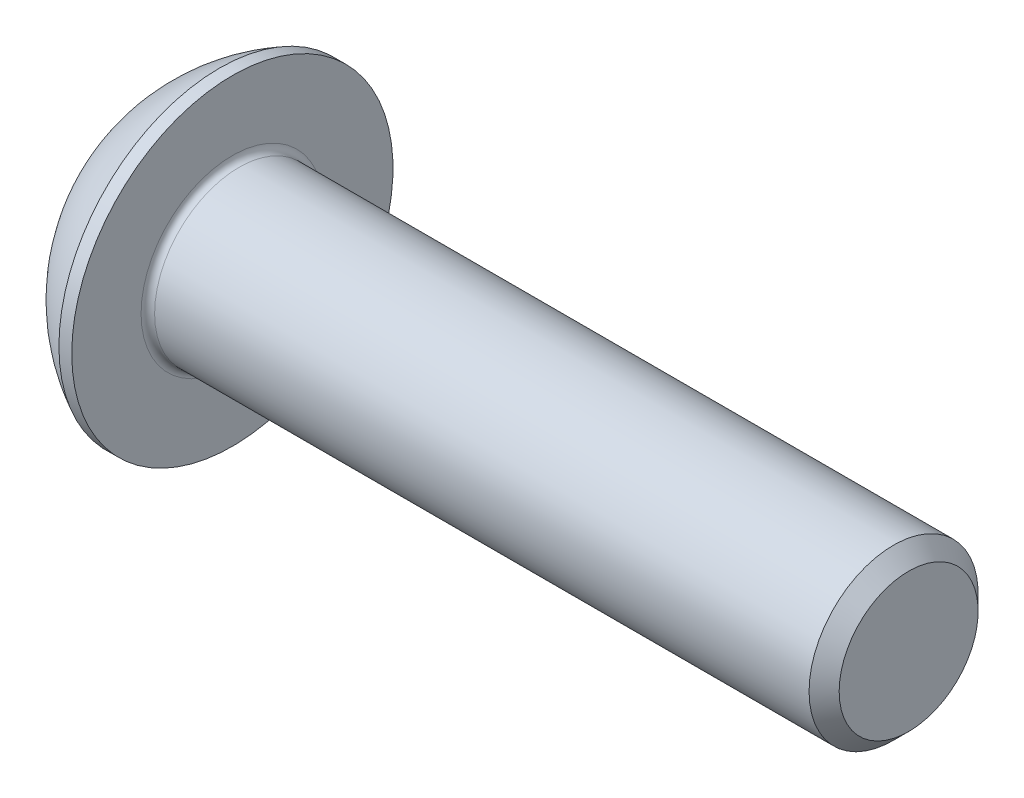
ISO-10303-21;
HEADER;
FILE_DESCRIPTION(('STEP AP214'),'2;1');
FILE_NAME('part.step','',(''),(''),'','','');
FILE_SCHEMA(('AUTOMOTIVE_DESIGN { 1 0 10303 214 1 1 1 1 }'));
ENDSEC;
DATA;
#1=APPLICATION_CONTEXT('core data for automotive mechanical design processes');
#2=APPLICATION_PROTOCOL_DEFINITION('international standard','automotive_design',2000,#1);
#3=PRODUCT_CONTEXT('',#1,'mechanical');
#4=PRODUCT('Part','Part','',(#3));
#5=PRODUCT_RELATED_PRODUCT_CATEGORY('part','',(#4));
#6=PRODUCT_DEFINITION_FORMATION('','',#4);
#7=PRODUCT_DEFINITION_CONTEXT('part definition',#1,'design');
#8=PRODUCT_DEFINITION('design','',#6,#7);
#9=PRODUCT_DEFINITION_SHAPE('','',#8);
#10=(LENGTH_UNIT() NAMED_UNIT(*) SI_UNIT(.MILLI.,.METRE.));
#11=(NAMED_UNIT(*) PLANE_ANGLE_UNIT() SI_UNIT($,.RADIAN.));
#12=(NAMED_UNIT(*) SI_UNIT($,.STERADIAN.) SOLID_ANGLE_UNIT());
#13=UNCERTAINTY_MEASURE_WITH_UNIT(LENGTH_MEASURE(1.E-05),#10,'distance_accuracy_value','');
#14=(GEOMETRIC_REPRESENTATION_CONTEXT(3) GLOBAL_UNCERTAINTY_ASSIGNED_CONTEXT((#13)) GLOBAL_UNIT_ASSIGNED_CONTEXT((#10,
#11,#12)) REPRESENTATION_CONTEXT('',''));
#15=CARTESIAN_POINT('',(0.,0.,0.));
#16=DIRECTION('',(0.,0.,1.));
#17=DIRECTION('',(1.,0.,0.));
#18=AXIS2_PLACEMENT_3D('',#15,#16,#17);
#19=CARTESIAN_POINT('',(0.,0.,0.));
#20=DIRECTION('',(-1.,0.,0.));
#21=DIRECTION('',(0.,0.,1.));
#22=AXIS2_PLACEMENT_3D('',#19,#20,#21);
#23=PLANE('',#22);
#24=CARTESIAN_POINT('',(0.,0.,0.));
#25=DIRECTION('',(-1.,0.,0.));
#26=DIRECTION('',(0.,0.,1.));
#27=AXIS2_PLACEMENT_3D('',#24,#25,#26);
#28=CIRCLE('',#27,2.375);
#29=CARTESIAN_POINT('',(0.,2.375,0.));
#30=VERTEX_POINT('',#29);
#31=EDGE_CURVE('E159',#30,#30,#28,.T.);
#32=ORIENTED_EDGE('',*,*,#31,.T.);
#33=EDGE_LOOP('',(#32));
#34=FACE_BOUND('',#33,.T.);
#35=DIRECTION('',(0.,-1.,0.));
#36=VECTOR('',#35,1.);
#37=CARTESIAN_POINT('',(0.,-0.866025403784438,1.5));
#38=LINE('',#37,#36);
#39=CARTESIAN_POINT('',(0.,0.866025403784439,1.5));
#40=VERTEX_POINT('',#39);
#41=CARTESIAN_POINT('',(0.,-0.866025403784438,1.5));
#42=VERTEX_POINT('',#41);
#43=EDGE_CURVE('E54',#40,#42,#38,.T.);
#44=ORIENTED_EDGE('',*,*,#43,.T.);
#45=DIRECTION('',(0.,-0.5,-0.866025403784438));
#46=VECTOR('',#45,1.);
#47=CARTESIAN_POINT('',(0.,-1.73205080756888,0.));
#48=LINE('',#47,#46);
#49=CARTESIAN_POINT('',(0.,-1.73205080756888,0.));
#50=VERTEX_POINT('',#49);
#51=EDGE_CURVE('E279',#42,#50,#48,.T.);
#52=ORIENTED_EDGE('',*,*,#51,.T.);
#53=DIRECTION('',(0.,0.5,-0.866025403784438));
#54=VECTOR('',#53,1.);
#55=CARTESIAN_POINT('',(0.,-0.866025403784438,-1.5));
#56=LINE('',#55,#54);
#57=CARTESIAN_POINT('',(0.,-0.866025403784438,-1.5));
#58=VERTEX_POINT('',#57);
#59=EDGE_CURVE('E134',#50,#58,#56,.T.);
#60=ORIENTED_EDGE('',*,*,#59,.T.);
#61=DIRECTION('',(0.,1.,0.));
#62=VECTOR('',#61,1.);
#63=CARTESIAN_POINT('',(0.,0.866025403784439,-1.5));
#64=LINE('',#63,#62);
#65=CARTESIAN_POINT('',(0.,0.866025403784439,-1.5));
#66=VERTEX_POINT('',#65);
#67=EDGE_CURVE('E282',#58,#66,#64,.T.);
#68=ORIENTED_EDGE('',*,*,#67,.T.);
#69=DIRECTION('',(0.,0.5,0.866025403784439));
#70=VECTOR('',#69,1.);
#71=CARTESIAN_POINT('',(0.,1.73205080756888,0.));
#72=LINE('',#71,#70);
#73=CARTESIAN_POINT('',(0.,1.73205080756888,0.));
#74=VERTEX_POINT('',#73);
#75=EDGE_CURVE('E284',#66,#74,#72,.T.);
#76=ORIENTED_EDGE('',*,*,#75,.T.);
#77=DIRECTION('',(0.,-0.5,0.866025403784439));
#78=VECTOR('',#77,1.);
#79=CARTESIAN_POINT('',(0.,0.866025403784439,1.5));
#80=LINE('',#79,#78);
#81=EDGE_CURVE('E286',#74,#40,#80,.T.);
#82=ORIENTED_EDGE('',*,*,#81,.T.);
#83=EDGE_LOOP('',(#44,#52,#60,#68,#76,#82));
#84=FACE_BOUND('',#83,.T.);
#85=ADVANCED_FACE('F39',(#34,#84),#23,.T.);
#86=CARTESIAN_POINT('',(4.75501582278481,0.,0.));
#87=DIRECTION('',(-1.,0.,0.));
#88=DIRECTION('',(0.,1.,0.));
#89=AXIS2_PLACEMENT_3D('',#86,#87,#88);
#90=SPHERICAL_SURFACE('',#89,5.3151482081814);
#91=CARTESIAN_POINT('',(2.37,0.,0.));
#92=DIRECTION('',(-1.,0.,0.));
#93=DIRECTION('',(0.,0.,1.));
#94=AXIS2_PLACEMENT_3D('',#91,#92,#93);
#95=CIRCLE('',#94,4.75);
#96=CARTESIAN_POINT('',(2.37,4.75,0.));
#97=VERTEX_POINT('',#96);
#98=EDGE_CURVE('E156',#97,#97,#95,.T.);
#99=CARTESIAN_POINT('',(2.37,4.75,0.));
#100=CARTESIAN_POINT('',(2.33822259048669,4.73404434732511,0.));
#101=CARTESIAN_POINT('',(2.30660534291523,4.71776971995817,0.));
#102=CARTESIAN_POINT('',(2.24370380094997,4.68458927158339,0.));
#103=CARTESIAN_POINT('',(2.21241950655618,4.66768345057555,0.));
#104=CARTESIAN_POINT('',(2.15019650024021,4.6332473706621,0.));
#105=CARTESIAN_POINT('',(2.11925778831804,4.6157171117565,0.));
#106=CARTESIAN_POINT('',(2.05773840110808,4.58003923142985,0.));
#107=CARTESIAN_POINT('',(2.02715772582028,4.56189161000879,0.));
#108=CARTESIAN_POINT('',(1.96636673145741,4.52498631044657,0.));
#109=CARTESIAN_POINT('',(1.93615641238234,4.50622863230542,0.));
#110=CARTESIAN_POINT('',(1.87611829826807,4.46811077571318,0.));
#111=CARTESIAN_POINT('',(1.84629050322887,4.44875059726211,0.));
#112=CARTESIAN_POINT('',(1.78702945162455,4.40943553782984,0.));
#113=CARTESIAN_POINT('',(1.75759619505941,4.38948065684866,0.));
#114=CARTESIAN_POINT('',(1.69913607574061,4.34898423002648,0.));
#115=CARTESIAN_POINT('',(1.67010921298694,4.32844268418549,0.));
#116=CARTESIAN_POINT('',(1.61247357298735,4.28678120152175,0.));
#117=CARTESIAN_POINT('',(1.58386479574143,4.265661264699,0.));
#118=CARTESIAN_POINT('',(1.52707685004032,4.22285150694424,0.));
#119=CARTESIAN_POINT('',(1.49889768158512,4.20116168601223,0.));
#120=CARTESIAN_POINT('',(1.44298030371049,4.15722089644741,0.));
#121=CARTESIAN_POINT('',(1.41524209429107,4.13496992781461,0.));
#122=CARTESIAN_POINT('',(1.36021780711889,4.08991580528235,0.));
#123=CARTESIAN_POINT('',(1.33293172936613,4.06711265138288,0.));
#124=CARTESIAN_POINT('',(1.278822696045,4.02096334316478,0.));
#125=CARTESIAN_POINT('',(1.25199974047662,3.99761718884614,0.));
#126=CARTESIAN_POINT('',(1.19882775550162,3.95039128335163,0.));
#127=CARTESIAN_POINT('',(1.172478726095,3.92651153217576,0.));
#128=CARTESIAN_POINT('',(1.1202652065289,3.87822805145535,0.));
#129=CARTESIAN_POINT('',(1.09440071636942,3.85382432191081,0.));
#130=CARTESIAN_POINT('',(1.04316669321617,3.8045027139941,0.));
#131=CARTESIAN_POINT('',(1.01779716022241,3.77958483562192,0.));
#132=CARTESIAN_POINT('',(0.967563269956099,3.72924496668416,0.));
#133=CARTESIAN_POINT('',(0.942698912683561,3.70382297611859,0.));
#134=CARTESIAN_POINT('',(0.893485388936279,3.65248512247887,0.));
#135=CARTESIAN_POINT('',(0.869136222461535,3.62656925940472,0.));
#136=CARTESIAN_POINT('',(0.820962887873489,3.57425409935884,0.));
#137=CARTESIAN_POINT('',(0.797138719760187,3.54785480238711,0.));
#138=CARTESIAN_POINT('',(0.750024977995377,3.49458340787865,0.));
#139=CARTESIAN_POINT('',(0.726735404343868,3.46771131034191,0.));
#140=CARTESIAN_POINT('',(0.68070023227454,3.41350513847464,0.));
#141=CARTESIAN_POINT('',(0.65795463385672,3.3861710641441,0.));
#142=CARTESIAN_POINT('',(0.613016573919582,3.33105194853939,0.));
#143=CARTESIAN_POINT('',(0.590824112400263,3.30326690726522,0.));
#144=CARTESIAN_POINT('',(0.547001265128254,3.24725704926748,0.));
#145=CARTESIAN_POINT('',(0.525370879375564,3.21903223254391,0.));
#146=CARTESIAN_POINT('',(0.482680896105489,3.16215419227901,0.));
#147=CARTESIAN_POINT('',(0.461621298588104,3.13350096873769,0.));
#148=CARTESIAN_POINT('',(0.420081374357153,3.07577765602272,0.));
#149=CARTESIAN_POINT('',(0.399601047643587,3.04670756684908,0.));
#150=CARTESIAN_POINT('',(0.359227914239947,2.98816223197683,0.));
#151=CARTESIAN_POINT('',(0.339335107549872,2.95868698627821,0.));
#152=CARTESIAN_POINT('',(0.300145026860786,2.89934321060632,0.));
#153=CARTESIAN_POINT('',(0.280847752861776,2.86947468063304,0.));
#154=CARTESIAN_POINT('',(0.24285650999714,2.80935636725696,0.));
#155=CARTESIAN_POINT('',(0.224162541131515,2.77910658385417,0.));
#156=CARTESIAN_POINT('',(0.187385439283607,2.71823794734018,0.));
#157=CARTESIAN_POINT('',(0.169302306301325,2.68761909422898,0.));
#158=CARTESIAN_POINT('',(0.133754156035989,2.626024653246,0.));
#159=CARTESIAN_POINT('',(0.116289138752934,2.59504906537421,0.));
#160=CARTESIAN_POINT('',(0.081984269005742,2.53275362391635,0.));
#161=CARTESIAN_POINT('',(0.0651444165416041,2.50143377033028,0.));
#162=CARTESIAN_POINT('',(0.0320966055444299,2.43846244094735,0.));
#163=CARTESIAN_POINT('',(0.0158886470113937,2.40681096515049,0.));
#164=CARTESIAN_POINT('',(0.,2.375,0.));
#165=B_SPLINE_CURVE_WITH_KNOTS('',3,(#99,#100,#101,#102,#103,#104,#105,#106,#107,#108,#109,#110,
#111,#112,#113,#114,#115,#116,#117,#118,#119,#120,#121,#122,#123,#124,#125,#126,#127,#128,#129,
#130,#131,#132,#133,#134,#135,#136,#137,#138,#139,#140,#141,#142,#143,#144,#145,#146,#147,#148,
#149,#150,#151,#152,#153,#154,#155,#156,#157,#158,#159,#160,#161,#162,#163,#164),.UNSPECIFIED.,
.F.,.F.,(4,2,2,2,2,2,2,2,2,2,2,2,2,2,2,2,2,2,2,2,2,2,2,2,2,2,2,2,2,2,2,2,4),(0.,
0.106672849678272,0.213345699356545,0.320018549034817,0.42669139871309,0.533364248391363,
0.640037098069636,0.746709947747908,0.85338279742618,0.960055647104453,1.06672849678273,
1.173401346461,1.28007419613927,1.38674704581754,1.49341989549582,1.60009274517409,
1.70676559485236,1.81343844453063,1.92011129420891,2.02678414388718,2.13345699356545,
2.24012984324372,2.346802692922,2.45347554260027,2.56014839227854,2.66682124195681,
2.77349409163509,2.88016694131336,2.98683979099163,3.0935126406699,3.20018549034818,
3.30685834002645,3.41353118970472),.UNSPECIFIED.);
#166=EDGE_CURVE('BSEAM180',#97,#30,#165,.T.);
#167=ORIENTED_EDGE('',*,*,#98,.T.);
#168=ORIENTED_EDGE('',*,*,#31,.F.);
#169=ORIENTED_EDGE('',*,*,#166,.T.);
#170=ORIENTED_EDGE('',*,*,#166,.F.);
#171=EDGE_LOOP('',(#167,#169,#168,#170));
#172=FACE_BOUND('',#171,.T.);
#173=ADVANCED_FACE('F180',(#172),#90,.T.);
#174=CARTESIAN_POINT('',(0.,0.,0.));
#175=DIRECTION('',(-1.,0.,0.));
#176=DIRECTION('',(0.,0.,1.));
#177=AXIS2_PLACEMENT_3D('',#174,#175,#176);
#178=CYLINDRICAL_SURFACE('',#177,4.75);
#179=ORIENTED_EDGE('',*,*,#98,.F.);
#180=EDGE_LOOP('',(#179));
#181=FACE_BOUND('',#180,.T.);
#182=CARTESIAN_POINT('',(2.75,0.,0.));
#183=DIRECTION('',(-1.,0.,0.));
#184=DIRECTION('',(0.,0.,1.));
#185=AXIS2_PLACEMENT_3D('',#182,#183,#184);
#186=CIRCLE('',#185,4.75);
#187=CARTESIAN_POINT('',(2.75,0.,4.75));
#188=VERTEX_POINT('',#187);
#189=EDGE_CURVE('E153',#188,#188,#186,.T.);
#190=ORIENTED_EDGE('',*,*,#189,.T.);
#191=EDGE_LOOP('',(#190));
#192=FACE_BOUND('',#191,.T.);
#193=ADVANCED_FACE('F185',(#181,#192),#178,.T.);
#194=CARTESIAN_POINT('',(2.75,2.5,0.));
#195=DIRECTION('',(-1.,0.,0.));
#196=DIRECTION('',(0.,0.,1.));
#197=AXIS2_PLACEMENT_3D('',#194,#195,#196);
#198=PLANE('',#197);
#199=CARTESIAN_POINT('',(2.75,0.,0.));
#200=DIRECTION('',(-1.,0.,0.));
#201=DIRECTION('',(0.,0.,1.));
#202=AXIS2_PLACEMENT_3D('',#199,#200,#201);
#203=CIRCLE('',#202,2.7);
#204=CARTESIAN_POINT('',(2.75,0.,2.7));
#205=VERTEX_POINT('',#204);
#206=EDGE_CURVE('E47',#205,#205,#203,.T.);
#207=ORIENTED_EDGE('',*,*,#206,.T.);
#208=EDGE_LOOP('',(#207));
#209=FACE_BOUND('',#208,.T.);
#210=ORIENTED_EDGE('',*,*,#189,.F.);
#211=EDGE_LOOP('',(#210));
#212=FACE_BOUND('',#211,.T.);
#213=ADVANCED_FACE('F164',(#209,#212),#198,.F.);
#214=CARTESIAN_POINT('',(0.,0.,0.));
#215=DIRECTION('',(-1.,0.,0.));
#216=DIRECTION('',(0.,0.,1.));
#217=AXIS2_PLACEMENT_3D('',#214,#215,#216);
#218=CYLINDRICAL_SURFACE('',#217,2.5);
#219=CARTESIAN_POINT('',(2.95,0.,0.));
#220=DIRECTION('',(-1.,0.,0.));
#221=DIRECTION('',(0.,0.,1.));
#222=AXIS2_PLACEMENT_3D('',#219,#220,#221);
#223=CIRCLE('',#222,2.5);
#224=CARTESIAN_POINT('',(2.95,0.,2.5));
#225=VERTEX_POINT('',#224);
#226=EDGE_CURVE('E11',#225,#225,#223,.F.);
#227=ORIENTED_EDGE('',*,*,#226,.T.);
#228=EDGE_LOOP('',(#227));
#229=FACE_BOUND('',#228,.T.);
#230=CARTESIAN_POINT('',(22.305,0.,0.));
#231=DIRECTION('',(-1.,0.,0.));
#232=DIRECTION('',(0.,0.,1.));
#233=AXIS2_PLACEMENT_3D('',#230,#231,#232);
#234=CIRCLE('',#233,2.5);
#235=CARTESIAN_POINT('',(22.305,0.,2.5));
#236=VERTEX_POINT('',#235);
#237=EDGE_CURVE('E150',#236,#236,#234,.T.);
#238=ORIENTED_EDGE('',*,*,#237,.T.);
#239=EDGE_LOOP('',(#238));
#240=FACE_BOUND('',#239,.T.);
#241=ADVANCED_FACE('F194',(#229,#240),#218,.T.);
#242=CARTESIAN_POINT('',(22.75,0.,0.));
#243=DIRECTION('',(-1.,0.,0.));
#244=DIRECTION('',(0.,0.,1.));
#245=AXIS2_PLACEMENT_3D('',#242,#243,#244);
#246=CONICAL_SURFACE('',#245,2.055,0.785398163397448);
#247=ORIENTED_EDGE('',*,*,#237,.F.);
#248=EDGE_LOOP('',(#247));
#249=FACE_BOUND('',#248,.T.);
#250=CARTESIAN_POINT('',(22.75,0.,0.));
#251=DIRECTION('',(-1.,0.,0.));
#252=DIRECTION('',(0.,0.,1.));
#253=AXIS2_PLACEMENT_3D('',#250,#251,#252);
#254=CIRCLE('',#253,2.055);
#255=CARTESIAN_POINT('',(22.75,0.,2.055));
#256=VERTEX_POINT('',#255);
#257=EDGE_CURVE('E146',#256,#256,#254,.T.);
#258=ORIENTED_EDGE('',*,*,#257,.T.);
#259=EDGE_LOOP('',(#258));
#260=FACE_BOUND('',#259,.T.);
#261=ADVANCED_FACE('F175',(#249,#260),#246,.T.);
#262=CARTESIAN_POINT('',(22.75,0.,0.));
#263=DIRECTION('',(-1.,0.,0.));
#264=DIRECTION('',(0.,0.,1.));
#265=AXIS2_PLACEMENT_3D('',#262,#263,#264);
#266=PLANE('',#265);
#267=ORIENTED_EDGE('',*,*,#257,.F.);
#268=EDGE_LOOP('',(#267));
#269=FACE_BOUND('',#268,.T.);
#270=ADVANCED_FACE('F168',(#269),#266,.F.);
#271=CARTESIAN_POINT('',(2.95,0.,0.));
#272=DIRECTION('',(-1.,0.,0.));
#273=DIRECTION('',(0.,0.,1.));
#274=AXIS2_PLACEMENT_3D('',#271,#272,#273);
#275=TOROIDAL_SURFACE('',#274,2.7,0.2);
#276=ORIENTED_EDGE('',*,*,#226,.F.);
#277=EDGE_LOOP('',(#276));
#278=FACE_BOUND('',#277,.T.);
#279=ORIENTED_EDGE('',*,*,#206,.F.);
#280=EDGE_LOOP('',(#279));
#281=FACE_BOUND('',#280,.T.);
#282=ADVANCED_FACE('F41',(#278,#281),#275,.F.);
#283=CARTESIAN_POINT('',(1.56,-1.73205080756888,0.));
#284=DIRECTION('',(0.,0.866025403784438,-0.5));
#285=DIRECTION('',(0.,0.5,0.866025403784439));
#286=AXIS2_PLACEMENT_3D('',#283,#284,#285);
#287=PLANE('',#286);
#288=DIRECTION('',(0.,-0.5,-0.866025403784438));
#289=VECTOR('',#288,1.);
#290=CARTESIAN_POINT('',(1.56,-1.73205080756888,0.));
#291=LINE('',#290,#289);
#292=CARTESIAN_POINT('',(1.56,-0.866025403784438,1.5));
#293=VERTEX_POINT('',#292);
#294=CARTESIAN_POINT('',(1.56,-1.29903810567666,0.75));
#295=VERTEX_POINT('',#294);
#296=EDGE_CURVE('E120',#293,#295,#291,.T.);
#297=ORIENTED_EDGE('',*,*,#296,.T.);
#298=CARTESIAN_POINT('',(1.56,-1.73205080756888,0.));
#299=VERTEX_POINT('',#298);
#300=EDGE_CURVE('E115',#295,#299,#291,.T.);
#301=ORIENTED_EDGE('',*,*,#300,.T.);
#302=DIRECTION('',(-1.,0.,0.));
#303=VECTOR('',#302,1.);
#304=CARTESIAN_POINT('',(1.56,-1.73205080756888,0.));
#305=LINE('',#304,#303);
#306=EDGE_CURVE('E117',#299,#50,#305,.T.);
#307=ORIENTED_EDGE('',*,*,#306,.T.);
#308=ORIENTED_EDGE('',*,*,#51,.F.);
#309=DIRECTION('',(-1.,0.,0.));
#310=VECTOR('',#309,1.);
#311=CARTESIAN_POINT('',(1.56,-0.866025403784438,1.5));
#312=LINE('',#311,#310);
#313=EDGE_CURVE('E275',#293,#42,#312,.T.);
#314=ORIENTED_EDGE('',*,*,#313,.F.);
#315=EDGE_LOOP('',(#297,#301,#307,#308,#314));
#316=FACE_BOUND('',#315,.T.);
#317=ADVANCED_FACE('F116',(#316),#287,.T.);
#318=CARTESIAN_POINT('',(1.56,-0.866025403784438,-1.5));
#319=DIRECTION('',(0.,0.866025403784438,0.5));
#320=DIRECTION('',(0.,-0.5,0.866025403784439));
#321=AXIS2_PLACEMENT_3D('',#318,#319,#320);
#322=PLANE('',#321);
#323=DIRECTION('',(0.,0.5,-0.866025403784438));
#324=VECTOR('',#323,1.);
#325=CARTESIAN_POINT('',(1.56,-0.866025403784438,-1.5));
#326=LINE('',#325,#324);
#327=CARTESIAN_POINT('',(1.56,-1.29903810567666,-0.750000000000001));
#328=VERTEX_POINT('',#327);
#329=EDGE_CURVE('E62',#299,#328,#326,.T.);
#330=ORIENTED_EDGE('',*,*,#329,.T.);
#331=CARTESIAN_POINT('',(1.56,-0.866025403784438,-1.5));
#332=VERTEX_POINT('',#331);
#333=EDGE_CURVE('E129',#328,#332,#326,.T.);
#334=ORIENTED_EDGE('',*,*,#333,.T.);
#335=DIRECTION('',(-1.,0.,0.));
#336=VECTOR('',#335,1.);
#337=CARTESIAN_POINT('',(1.56,-0.866025403784438,-1.5));
#338=LINE('',#337,#336);
#339=EDGE_CURVE('E136',#332,#58,#338,.T.);
#340=ORIENTED_EDGE('',*,*,#339,.T.);
#341=ORIENTED_EDGE('',*,*,#59,.F.);
#342=ORIENTED_EDGE('',*,*,#306,.F.);
#343=EDGE_LOOP('',(#330,#334,#340,#341,#342));
#344=FACE_BOUND('',#343,.T.);
#345=ADVANCED_FACE('F132',(#344),#322,.T.);
#346=CARTESIAN_POINT('',(1.56,0.866025403784439,-1.5));
#347=DIRECTION('',(0.,0.,1.));
#348=DIRECTION('',(1.,0.,0.));
#349=AXIS2_PLACEMENT_3D('',#346,#347,#348);
#350=PLANE('',#349);
#351=DIRECTION('',(0.,1.,0.));
#352=VECTOR('',#351,1.);
#353=CARTESIAN_POINT('',(1.56,0.866025403784439,-1.5));
#354=LINE('',#353,#352);
#355=CARTESIAN_POINT('',(1.56,0.,-1.5));
#356=VERTEX_POINT('',#355);
#357=EDGE_CURVE('E256',#332,#356,#354,.T.);
#358=ORIENTED_EDGE('',*,*,#357,.T.);
#359=CARTESIAN_POINT('',(1.56,0.866025403784439,-1.5));
#360=VERTEX_POINT('',#359);
#361=EDGE_CURVE('E128',#356,#360,#354,.T.);
#362=ORIENTED_EDGE('',*,*,#361,.T.);
#363=DIRECTION('',(-1.,0.,0.));
#364=VECTOR('',#363,1.);
#365=CARTESIAN_POINT('',(1.56,0.866025403784439,-1.5));
#366=LINE('',#365,#364);
#367=EDGE_CURVE('E141',#360,#66,#366,.T.);
#368=ORIENTED_EDGE('',*,*,#367,.T.);
#369=ORIENTED_EDGE('',*,*,#67,.F.);
#370=ORIENTED_EDGE('',*,*,#339,.F.);
#371=EDGE_LOOP('',(#358,#362,#368,#369,#370));
#372=FACE_BOUND('',#371,.T.);
#373=ADVANCED_FACE('F208',(#372),#350,.T.);
#374=CARTESIAN_POINT('',(1.56,1.73205080756888,0.));
#375=DIRECTION('',(0.,-0.866025403784438,0.5));
#376=DIRECTION('',(0.,-0.5,-0.866025403784439));
#377=AXIS2_PLACEMENT_3D('',#374,#375,#376);
#378=PLANE('',#377);
#379=DIRECTION('',(0.,0.5,0.866025403784439));
#380=VECTOR('',#379,1.);
#381=CARTESIAN_POINT('',(1.56,1.73205080756888,0.));
#382=LINE('',#381,#380);
#383=CARTESIAN_POINT('',(1.56,1.29903810567666,-0.75));
#384=VERTEX_POINT('',#383);
#385=EDGE_CURVE('E245',#360,#384,#382,.T.);
#386=ORIENTED_EDGE('',*,*,#385,.T.);
#387=CARTESIAN_POINT('',(1.56,1.73205080756888,0.));
#388=VERTEX_POINT('',#387);
#389=EDGE_CURVE('E250',#384,#388,#382,.T.);
#390=ORIENTED_EDGE('',*,*,#389,.T.);
#391=DIRECTION('',(-1.,0.,0.));
#392=VECTOR('',#391,1.);
#393=CARTESIAN_POINT('',(1.56,1.73205080756888,0.));
#394=LINE('',#393,#392);
#395=EDGE_CURVE('E290',#388,#74,#394,.T.);
#396=ORIENTED_EDGE('',*,*,#395,.T.);
#397=ORIENTED_EDGE('',*,*,#75,.F.);
#398=ORIENTED_EDGE('',*,*,#367,.F.);
#399=EDGE_LOOP('',(#386,#390,#396,#397,#398));
#400=FACE_BOUND('',#399,.T.);
#401=ADVANCED_FACE('F211',(#400),#378,.T.);
#402=CARTESIAN_POINT('',(1.56,0.866025403784439,1.5));
#403=DIRECTION('',(0.,-0.866025403784438,-0.5));
#404=DIRECTION('',(0.,0.5,-0.866025403784439));
#405=AXIS2_PLACEMENT_3D('',#402,#403,#404);
#406=PLANE('',#405);
#407=DIRECTION('',(0.,-0.5,0.866025403784439));
#408=VECTOR('',#407,1.);
#409=CARTESIAN_POINT('',(1.56,0.866025403784439,1.5));
#410=LINE('',#409,#408);
#411=CARTESIAN_POINT('',(1.56,1.29903810567666,0.75));
#412=VERTEX_POINT('',#411);
#413=EDGE_CURVE('E253',#388,#412,#410,.T.);
#414=ORIENTED_EDGE('',*,*,#413,.T.);
#415=CARTESIAN_POINT('',(1.56,0.866025403784439,1.5));
#416=VERTEX_POINT('',#415);
#417=EDGE_CURVE('E261',#412,#416,#410,.T.);
#418=ORIENTED_EDGE('',*,*,#417,.T.);
#419=DIRECTION('',(-1.,0.,0.));
#420=VECTOR('',#419,1.);
#421=CARTESIAN_POINT('',(1.56,0.866025403784439,1.5));
#422=LINE('',#421,#420);
#423=EDGE_CURVE('E274',#416,#40,#422,.T.);
#424=ORIENTED_EDGE('',*,*,#423,.T.);
#425=ORIENTED_EDGE('',*,*,#81,.F.);
#426=ORIENTED_EDGE('',*,*,#395,.F.);
#427=EDGE_LOOP('',(#414,#418,#424,#425,#426));
#428=FACE_BOUND('',#427,.T.);
#429=ADVANCED_FACE('F215',(#428),#406,.T.);
#430=CARTESIAN_POINT('',(1.56,-0.866025403784438,1.5));
#431=DIRECTION('',(0.,0.,-1.));
#432=DIRECTION('',(-1.,0.,0.));
#433=AXIS2_PLACEMENT_3D('',#430,#431,#432);
#434=PLANE('',#433);
#435=DIRECTION('',(0.,-1.,0.));
#436=VECTOR('',#435,1.);
#437=CARTESIAN_POINT('',(1.56,-0.866025403784438,1.5));
#438=LINE('',#437,#436);
#439=CARTESIAN_POINT('',(1.56,0.,1.5));
#440=VERTEX_POINT('',#439);
#441=EDGE_CURVE('E267',#416,#440,#438,.T.);
#442=ORIENTED_EDGE('',*,*,#441,.T.);
#443=EDGE_CURVE('E269',#440,#293,#438,.T.);
#444=ORIENTED_EDGE('',*,*,#443,.T.);
#445=ORIENTED_EDGE('',*,*,#313,.T.);
#446=ORIENTED_EDGE('',*,*,#43,.F.);
#447=ORIENTED_EDGE('',*,*,#423,.F.);
#448=EDGE_LOOP('',(#442,#444,#445,#446,#447));
#449=FACE_BOUND('',#448,.T.);
#450=ADVANCED_FACE('F219',(#449),#434,.T.);
#451=CARTESIAN_POINT('',(1.56,-1.73205080756888,0.));
#452=DIRECTION('',(1.,0.,0.));
#453=DIRECTION('',(0.,0.,-1.));
#454=AXIS2_PLACEMENT_3D('',#451,#452,#453);
#455=PLANE('',#454);
#456=CARTESIAN_POINT('',(1.56,0.,0.));
#457=DIRECTION('',(-1.,0.,0.));
#458=DIRECTION('',(0.,0.,1.));
#459=AXIS2_PLACEMENT_3D('',#456,#457,#458);
#460=CIRCLE('',#459,1.5);
#461=EDGE_CURVE('E242',#384,#356,#460,.T.);
#462=ORIENTED_EDGE('',*,*,#461,.F.);
#463=ORIENTED_EDGE('',*,*,#385,.F.);
#464=ORIENTED_EDGE('',*,*,#361,.F.);
#465=EDGE_LOOP('',(#462,#463,#464));
#466=FACE_BOUND('',#465,.T.);
#467=ADVANCED_FACE('F223',(#466),#455,.F.);
#468=EDGE_CURVE('E147',#412,#384,#460,.T.);
#469=ORIENTED_EDGE('',*,*,#468,.F.);
#470=ORIENTED_EDGE('',*,*,#413,.F.);
#471=ORIENTED_EDGE('',*,*,#389,.F.);
#472=EDGE_LOOP('',(#469,#470,#471));
#473=FACE_BOUND('',#472,.T.);
#474=ADVANCED_FACE('F232',(#473),#455,.F.);
#475=EDGE_CURVE('E140',#440,#412,#460,.T.);
#476=ORIENTED_EDGE('',*,*,#475,.F.);
#477=ORIENTED_EDGE('',*,*,#441,.F.);
#478=ORIENTED_EDGE('',*,*,#417,.F.);
#479=EDGE_LOOP('',(#476,#477,#478));
#480=FACE_BOUND('',#479,.T.);
#481=ADVANCED_FACE('F237',(#480),#455,.F.);
#482=EDGE_CURVE('E135',#295,#440,#460,.T.);
#483=ORIENTED_EDGE('',*,*,#482,.F.);
#484=ORIENTED_EDGE('',*,*,#296,.F.);
#485=ORIENTED_EDGE('',*,*,#443,.F.);
#486=EDGE_LOOP('',(#483,#484,#485));
#487=FACE_BOUND('',#486,.T.);
#488=ADVANCED_FACE('F230',(#487),#455,.F.);
#489=EDGE_CURVE('E126',#328,#295,#460,.T.);
#490=ORIENTED_EDGE('',*,*,#489,.F.);
#491=ORIENTED_EDGE('',*,*,#329,.F.);
#492=ORIENTED_EDGE('',*,*,#300,.F.);
#493=EDGE_LOOP('',(#490,#491,#492));
#494=FACE_BOUND('',#493,.T.);
#495=ADVANCED_FACE('F125',(#494),#455,.F.);
#496=EDGE_CURVE('E248',#356,#328,#460,.T.);
#497=ORIENTED_EDGE('',*,*,#496,.F.);
#498=ORIENTED_EDGE('',*,*,#357,.F.);
#499=ORIENTED_EDGE('',*,*,#333,.F.);
#500=EDGE_LOOP('',(#497,#498,#499));
#501=FACE_BOUND('',#500,.T.);
#502=ADVANCED_FACE('F203',(#501),#455,.F.);
#503=CARTESIAN_POINT('',(2.42602540378445,0.,0.));
#504=DIRECTION('',(-1.,0.,0.));
#505=DIRECTION('',(0.,0.,1.));
#506=AXIS2_PLACEMENT_3D('',#503,#504,#505);
#507=CONICAL_SURFACE('',#506,0.,1.04719755119659);
#508=ORIENTED_EDGE('',*,*,#475,.T.);
#509=ORIENTED_EDGE('',*,*,#468,.T.);
#510=ORIENTED_EDGE('',*,*,#461,.T.);
#511=ORIENTED_EDGE('',*,*,#496,.T.);
#512=ORIENTED_EDGE('',*,*,#489,.T.);
#513=ORIENTED_EDGE('',*,*,#482,.T.);
#514=EDGE_LOOP('',(#508,#509,#510,#511,#512,#513));
#515=FACE_BOUND('',#514,.T.);
#516=CARTESIAN_POINT('',(2.42602540378445,0.,0.));
#517=VERTEX_POINT('',#516);
#518=VERTEX_LOOP('',#517);
#519=FACE_BOUND('',#518,.T.);
#520=ADVANCED_FACE('F201',(#515,#519),#507,.F.);
#521=CLOSED_SHELL('',(#85,#173,#193,#213,#241,#261,#270,#282,#317,#345,#373,#401,#429,#450,#467,
#474,#481,#488,#495,#502,#520));
#522=MANIFOLD_SOLID_BREP('B2',#521);
#523=ADVANCED_BREP_SHAPE_REPRESENTATION('',(#18,#522),#14);
#524=SHAPE_DEFINITION_REPRESENTATION(#9,#523);
ENDSEC;
END-ISO-10303-21;
